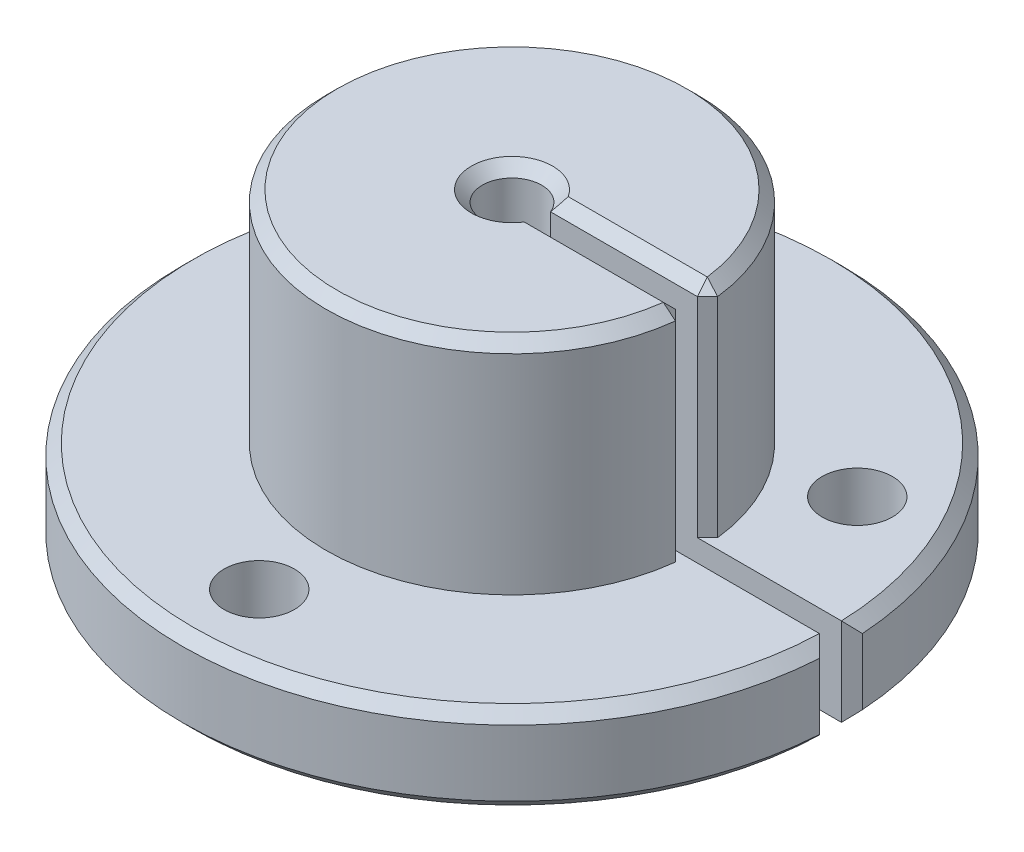
ISO-10303-21;
HEADER;
FILE_DESCRIPTION(('STEP AP214'),'2;1');
FILE_NAME('part.step','',(''),(''),'','','');
FILE_SCHEMA(('AUTOMOTIVE_DESIGN { 1 0 10303 214 1 1 1 1 }'));
ENDSEC;
DATA;
#1=APPLICATION_CONTEXT('core data for automotive mechanical design processes');
#2=APPLICATION_PROTOCOL_DEFINITION('international standard','automotive_design',2000,#1);
#3=PRODUCT_CONTEXT('',#1,'mechanical');
#4=PRODUCT('Part','Part','',(#3));
#5=PRODUCT_RELATED_PRODUCT_CATEGORY('part','',(#4));
#6=PRODUCT_DEFINITION_FORMATION('','',#4);
#7=PRODUCT_DEFINITION_CONTEXT('part definition',#1,'design');
#8=PRODUCT_DEFINITION('design','',#6,#7);
#9=PRODUCT_DEFINITION_SHAPE('','',#8);
#10=(LENGTH_UNIT() NAMED_UNIT(*) SI_UNIT(.MILLI.,.METRE.));
#11=(NAMED_UNIT(*) PLANE_ANGLE_UNIT() SI_UNIT($,.RADIAN.));
#12=(NAMED_UNIT(*) SI_UNIT($,.STERADIAN.) SOLID_ANGLE_UNIT());
#13=UNCERTAINTY_MEASURE_WITH_UNIT(LENGTH_MEASURE(1.E-05),#10,'distance_accuracy_value','');
#14=(GEOMETRIC_REPRESENTATION_CONTEXT(3) GLOBAL_UNCERTAINTY_ASSIGNED_CONTEXT((#13)) GLOBAL_UNIT_ASSIGNED_CONTEXT((#10,
#11,#12)) REPRESENTATION_CONTEXT('',''));
#15=CARTESIAN_POINT('',(0.,0.,0.));
#16=DIRECTION('',(0.,0.,1.));
#17=DIRECTION('',(1.,0.,0.));
#18=AXIS2_PLACEMENT_3D('',#15,#16,#17);
#19=CARTESIAN_POINT('',(0.,10.,0.));
#20=DIRECTION('',(0.,-1.,0.));
#21=DIRECTION('',(0.,0.,-1.));
#22=AXIS2_PLACEMENT_3D('',#19,#20,#21);
#23=CYLINDRICAL_SURFACE('',#22,8.45);
#24=CARTESIAN_POINT('',(0.,9.5,0.));
#25=DIRECTION('',(0.,1.,0.));
#26=DIRECTION('',(0.,0.,1.));
#27=AXIS2_PLACEMENT_3D('',#24,#25,#26);
#28=CIRCLE('',#27,8.45);
#29=CARTESIAN_POINT('',(8.39528047259499,9.5,0.960086343234377));
#30=VERTEX_POINT('',#29);
#31=CARTESIAN_POINT('',(8.39528047259499,9.5,-0.960086343234371));
#32=VERTEX_POINT('',#31);
#33=EDGE_CURVE('E448',#30,#32,#28,.F.);
#34=ORIENTED_EDGE('',*,*,#33,.T.);
#35=DIRECTION('',(0.,-1.,0.));
#36=VECTOR('',#35,1.);
#37=CARTESIAN_POINT('',(8.39528047259499,10.,-0.960086343234371));
#38=LINE('',#37,#36);
#39=CARTESIAN_POINT('',(8.39528047259499,0.,-0.960086343234371));
#40=VERTEX_POINT('',#39);
#41=EDGE_CURVE('E450',#32,#40,#38,.T.);
#42=ORIENTED_EDGE('',*,*,#41,.T.);
#43=CARTESIAN_POINT('',(0.,0.,0.));
#44=DIRECTION('',(0.,-1.,0.));
#45=DIRECTION('',(0.,0.,-1.));
#46=AXIS2_PLACEMENT_3D('',#43,#44,#45);
#47=CIRCLE('',#46,8.45);
#48=CARTESIAN_POINT('',(8.39528047259499,0.,0.960086343234377));
#49=VERTEX_POINT('',#48);
#50=EDGE_CURVE('E351',#49,#40,#47,.T.);
#51=ORIENTED_EDGE('',*,*,#50,.F.);
#52=DIRECTION('',(0.,-1.,0.));
#53=VECTOR('',#52,1.);
#54=CARTESIAN_POINT('',(8.39528047259499,10.,0.960086343234377));
#55=LINE('',#54,#53);
#56=EDGE_CURVE('E446',#49,#30,#55,.F.);
#57=ORIENTED_EDGE('',*,*,#56,.T.);
#58=EDGE_LOOP('',(#34,#42,#51,#57));
#59=FACE_BOUND('',#58,.T.);
#60=ADVANCED_FACE('F35',(#59),#23,.T.);
#61=CARTESIAN_POINT('',(0.,10.,0.));
#62=DIRECTION('',(0.,1.,0.));
#63=DIRECTION('',(0.,0.,1.));
#64=AXIS2_PLACEMENT_3D('',#61,#62,#63);
#65=PLANE('',#64);
#66=CARTESIAN_POINT('',(0.,10.,0.));
#67=DIRECTION('',(0.,1.,0.));
#68=DIRECTION('',(0.,0.,1.));
#69=AXIS2_PLACEMENT_3D('',#66,#67,#68);
#70=CIRCLE('',#69,7.95000000000001);
#71=CARTESIAN_POINT('',(7.88685615438751,10.,-0.999999999999997));
#72=VERTEX_POINT('',#71);
#73=CARTESIAN_POINT('',(7.88685615438751,10.,0.999999999999992));
#74=VERTEX_POINT('',#73);
#75=EDGE_CURVE('E440',#72,#74,#70,.T.);
#76=ORIENTED_EDGE('',*,*,#75,.T.);
#77=DIRECTION('',(-1.,0.,0.));
#78=VECTOR('',#77,1.);
#79=CARTESIAN_POINT('',(1.25399362039845,10.,0.999999999999993));
#80=LINE('',#79,#78);
#81=CARTESIAN_POINT('',(1.55643824162734,10.,0.999999999999993));
#82=VERTEX_POINT('',#81);
#83=EDGE_CURVE('E442',#74,#82,#80,.T.);
#84=ORIENTED_EDGE('',*,*,#83,.T.);
#85=CARTESIAN_POINT('',(0.,10.,0.));
#86=DIRECTION('',(0.,1.,0.));
#87=DIRECTION('',(0.,0.,1.));
#88=AXIS2_PLACEMENT_3D('',#85,#86,#87);
#89=CIRCLE('',#88,1.85);
#90=CARTESIAN_POINT('',(1.55643824162734,10.,-0.999999999999994));
#91=VERTEX_POINT('',#90);
#92=EDGE_CURVE('E433',#82,#91,#89,.F.);
#93=ORIENTED_EDGE('',*,*,#92,.T.);
#94=DIRECTION('',(1.,0.,0.));
#95=VECTOR('',#94,1.);
#96=CARTESIAN_POINT('',(8.43519412936063,10.,-0.999999999999997));
#97=LINE('',#96,#95);
#98=EDGE_CURVE('E439',#91,#72,#97,.T.);
#99=ORIENTED_EDGE('',*,*,#98,.T.);
#100=EDGE_LOOP('',(#76,#84,#93,#99));
#101=FACE_BOUND('',#100,.T.);
#102=ADVANCED_FACE('F295',(#101),#65,.T.);
#103=CARTESIAN_POINT('',(0.,-4.,0.));
#104=DIRECTION('',(0.,1.,0.));
#105=DIRECTION('',(0.,0.,1.));
#106=AXIS2_PLACEMENT_3D('',#103,#104,#105);
#107=CYLINDRICAL_SURFACE('',#106,15.);
#108=CARTESIAN_POINT('',(0.,-3.50000000000001,0.));
#109=DIRECTION('',(0.,-1.,0.));
#110=DIRECTION('',(0.,0.,-1.));
#111=AXIS2_PLACEMENT_3D('',#108,#109,#110);
#112=CIRCLE('',#111,15.);
#113=CARTESIAN_POINT('',(14.9681801465694,-3.50000000000001,-0.976515796004441));
#114=VERTEX_POINT('',#113);
#115=CARTESIAN_POINT('',(14.9681801465694,-3.50000000000001,0.976515796004442));
#116=VERTEX_POINT('',#115);
#117=EDGE_CURVE('E358',#114,#116,#112,.F.);
#118=ORIENTED_EDGE('',*,*,#117,.T.);
#119=DIRECTION('',(0.,1.,0.));
#120=VECTOR('',#119,1.);
#121=CARTESIAN_POINT('',(14.9681801465694,-4.,0.976515796004442));
#122=LINE('',#121,#120);
#123=CARTESIAN_POINT('',(14.9681801465694,-0.499999999999995,0.976515796004442));
#124=VERTEX_POINT('',#123);
#125=EDGE_CURVE('E489',#116,#124,#122,.T.);
#126=ORIENTED_EDGE('',*,*,#125,.T.);
#127=CARTESIAN_POINT('',(0.,-0.499999999999995,0.));
#128=DIRECTION('',(0.,-1.,0.));
#129=DIRECTION('',(0.,0.,-1.));
#130=AXIS2_PLACEMENT_3D('',#127,#128,#129);
#131=CIRCLE('',#130,15.);
#132=CARTESIAN_POINT('',(14.9681801465694,-0.499999999999995,-0.976515796004441));
#133=VERTEX_POINT('',#132);
#134=EDGE_CURVE('E484',#124,#133,#131,.T.);
#135=ORIENTED_EDGE('',*,*,#134,.T.);
#136=DIRECTION('',(0.,1.,0.));
#137=VECTOR('',#136,1.);
#138=CARTESIAN_POINT('',(14.9681801465694,-4.,-0.976515796004441));
#139=LINE('',#138,#137);
#140=EDGE_CURVE('E486',#133,#114,#139,.F.);
#141=ORIENTED_EDGE('',*,*,#140,.T.);
#142=EDGE_LOOP('',(#118,#126,#135,#141));
#143=FACE_BOUND('',#142,.T.);
#144=ADVANCED_FACE('F301',(#143),#107,.T.);
#145=CARTESIAN_POINT('',(0.,-4.,0.));
#146=DIRECTION('',(0.,-1.,0.));
#147=DIRECTION('',(0.,0.,-1.));
#148=AXIS2_PLACEMENT_3D('',#145,#146,#147);
#149=PLANE('',#148);
#150=CARTESIAN_POINT('',(0.,-4.,11.5));
#151=DIRECTION('',(0.,-1.,0.));
#152=DIRECTION('',(0.,0.,-1.));
#153=AXIS2_PLACEMENT_3D('',#150,#151,#152);
#154=CIRCLE('',#153,3.15);
#155=CARTESIAN_POINT('',(-1.07774925952802,-4.,14.4598913043534));
#156=VERTEX_POINT('',#155);
#157=CARTESIAN_POINT('',(1.07774925954286,-4.,14.4598913043479));
#158=VERTEX_POINT('',#157);
#159=EDGE_CURVE('E50',#156,#158,#154,.T.);
#160=ORIENTED_EDGE('',*,*,#159,.F.);
#161=CARTESIAN_POINT('',(0.,-4.,0.));
#162=DIRECTION('',(0.,-1.,0.));
#163=DIRECTION('',(0.,0.,-1.));
#164=AXIS2_PLACEMENT_3D('',#161,#162,#163);
#165=CIRCLE('',#164,14.5);
#166=CARTESIAN_POINT('',(-13.0615078352977,-4.,-6.29658741450128));
#167=VERTEX_POINT('',#166);
#168=EDGE_CURVE('E57',#156,#167,#165,.T.);
#169=ORIENTED_EDGE('',*,*,#168,.T.);
#170=CARTESIAN_POINT('',(-9.95929214352061,-4.,-5.75000000000019));
#171=DIRECTION('',(0.,-1.,0.));
#172=DIRECTION('',(0.,0.,-1.));
#173=AXIS2_PLACEMENT_3D('',#170,#171,#172);
#174=CIRCLE('',#173,3.15);
#175=CARTESIAN_POINT('',(-11.9837585757656,-4.,-8.16330388983946));
#176=VERTEX_POINT('',#175);
#177=EDGE_CURVE('E463',#176,#167,#174,.T.);
#178=ORIENTED_EDGE('',*,*,#177,.F.);
#179=CARTESIAN_POINT('',(11.9837585757553,-4.,-8.1633038898483));
#180=VERTEX_POINT('',#179);
#181=EDGE_CURVE('E172',#176,#180,#165,.T.);
#182=ORIENTED_EDGE('',*,*,#181,.T.);
#183=CARTESIAN_POINT('',(9.95929214352151,-4.,-5.74999999999978));
#184=DIRECTION('',(0.,-1.,0.));
#185=DIRECTION('',(0.,0.,-1.));
#186=AXIS2_PLACEMENT_3D('',#183,#184,#185);
#187=CIRCLE('',#186,3.15);
#188=CARTESIAN_POINT('',(13.0615078352958,-4.,-6.2965874145179));
#189=VERTEX_POINT('',#188);
#190=EDGE_CURVE('E345',#189,#180,#187,.T.);
#191=ORIENTED_EDGE('',*,*,#190,.F.);
#192=CARTESIAN_POINT('',(14.4913767461894,-4.,-0.500000000000007));
#193=VERTEX_POINT('',#192);
#194=EDGE_CURVE('E175',#189,#193,#165,.T.);
#195=ORIENTED_EDGE('',*,*,#194,.T.);
#196=DIRECTION('',(-1.,0.,0.));
#197=VECTOR('',#196,1.);
#198=CARTESIAN_POINT('',(30.0000000000001,-4.,-0.500000000000015));
#199=LINE('',#198,#197);
#200=CARTESIAN_POINT('',(1.78115131305568,-4.,-0.500000000000001));
#201=VERTEX_POINT('',#200);
#202=EDGE_CURVE('E343',#193,#201,#199,.T.);
#203=ORIENTED_EDGE('',*,*,#202,.T.);
#204=CARTESIAN_POINT('',(0.,-4.,0.));
#205=DIRECTION('',(0.,-1.,0.));
#206=DIRECTION('',(0.,0.,-1.));
#207=AXIS2_PLACEMENT_3D('',#204,#205,#206);
#208=CIRCLE('',#207,1.85);
#209=CARTESIAN_POINT('',(1.78115131305569,-4.,0.5));
#210=VERTEX_POINT('',#209);
#211=EDGE_CURVE('E178',#201,#210,#208,.F.);
#212=ORIENTED_EDGE('',*,*,#211,.T.);
#213=DIRECTION('',(1.,0.,0.));
#214=VECTOR('',#213,1.);
#215=CARTESIAN_POINT('',(30.0000000000001,-4.,0.499999999999997));
#216=LINE('',#215,#214);
#217=CARTESIAN_POINT('',(14.4913767461894,-4.,0.499999999999998));
#218=VERTEX_POINT('',#217);
#219=EDGE_CURVE('E352',#210,#218,#216,.T.);
#220=ORIENTED_EDGE('',*,*,#219,.T.);
#221=EDGE_CURVE('E166',#218,#158,#165,.T.);
#222=ORIENTED_EDGE('',*,*,#221,.T.);
#223=EDGE_LOOP('',(#160,#169,#178,#182,#191,#195,#203,#212,#220,#222));
#224=FACE_BOUND('',#223,.T.);
#225=ADVANCED_FACE('F164',(#224),#149,.T.);
#226=CARTESIAN_POINT('',(0.,0.,0.));
#227=DIRECTION('',(0.,-1.,0.));
#228=DIRECTION('',(0.,0.,-1.));
#229=AXIS2_PLACEMENT_3D('',#226,#227,#228);
#230=PLANE('',#229);
#231=CARTESIAN_POINT('',(0.,0.,11.5));
#232=DIRECTION('',(0.,-1.,0.));
#233=DIRECTION('',(0.,0.,-1.));
#234=AXIS2_PLACEMENT_3D('',#231,#232,#233);
#235=CIRCLE('',#234,1.59999999999999);
#236=CARTESIAN_POINT('',(0.,0.,9.90000000000001));
#237=VERTEX_POINT('',#236);
#238=EDGE_CURVE('E40',#237,#237,#235,.T.);
#239=ORIENTED_EDGE('',*,*,#238,.T.);
#240=EDGE_LOOP('',(#239));
#241=FACE_BOUND('',#240,.T.);
#242=CARTESIAN_POINT('',(-9.95929214352061,0.,-5.75000000000019));
#243=DIRECTION('',(0.,-1.,0.));
#244=DIRECTION('',(0.,0.,-1.));
#245=AXIS2_PLACEMENT_3D('',#242,#243,#244);
#246=CIRCLE('',#245,1.59999999999999);
#247=CARTESIAN_POINT('',(-9.95929214352061,0.,-7.35000000000019));
#248=VERTEX_POINT('',#247);
#249=EDGE_CURVE('E268',#248,#248,#246,.T.);
#250=ORIENTED_EDGE('',*,*,#249,.T.);
#251=EDGE_LOOP('',(#250));
#252=FACE_BOUND('',#251,.T.);
#253=CARTESIAN_POINT('',(9.95929214352151,0.,-5.74999999999978));
#254=DIRECTION('',(0.,-1.,0.));
#255=DIRECTION('',(0.,0.,-1.));
#256=AXIS2_PLACEMENT_3D('',#253,#254,#255);
#257=CIRCLE('',#256,1.59999999999999);
#258=CARTESIAN_POINT('',(9.95929214352151,0.,-7.34999999999977));
#259=VERTEX_POINT('',#258);
#260=EDGE_CURVE('E267',#259,#259,#257,.T.);
#261=ORIENTED_EDGE('',*,*,#260,.T.);
#262=EDGE_LOOP('',(#261));
#263=FACE_BOUND('',#262,.T.);
#264=DIRECTION('',(1.,0.,0.));
#265=VECTOR('',#264,1.);
#266=CARTESIAN_POINT('',(0.,0.,-0.5));
#267=LINE('',#266,#265);
#268=CARTESIAN_POINT('',(7.93519412936062,0.,-0.500000000000004));
#269=VERTEX_POINT('',#268);
#270=CARTESIAN_POINT('',(14.4913767461894,0.,-0.500000000000007));
#271=VERTEX_POINT('',#270);
#272=EDGE_CURVE('E478',#269,#271,#267,.T.);
#273=ORIENTED_EDGE('',*,*,#272,.T.);
#274=CARTESIAN_POINT('',(0.,0.,0.));
#275=DIRECTION('',(0.,-1.,0.));
#276=DIRECTION('',(0.,0.,-1.));
#277=AXIS2_PLACEMENT_3D('',#274,#275,#276);
#278=CIRCLE('',#277,14.5);
#279=CARTESIAN_POINT('',(14.4913767461894,0.,0.499999999999998));
#280=VERTEX_POINT('',#279);
#281=EDGE_CURVE('E216',#271,#280,#278,.F.);
#282=ORIENTED_EDGE('',*,*,#281,.T.);
#283=DIRECTION('',(-1.,0.,0.));
#284=VECTOR('',#283,1.);
#285=CARTESIAN_POINT('',(0.,0.,0.5));
#286=LINE('',#285,#284);
#287=CARTESIAN_POINT('',(7.93519412936062,0.,0.499999999999999));
#288=VERTEX_POINT('',#287);
#289=EDGE_CURVE('E476',#280,#288,#286,.T.);
#290=ORIENTED_EDGE('',*,*,#289,.T.);
#291=DIRECTION('',(0.707106781186547,0.,0.707106781186548));
#292=VECTOR('',#291,1.);
#293=CARTESIAN_POINT('',(3.71759706468032,0.,-3.71759706468031));
#294=LINE('',#293,#292);
#295=EDGE_CURVE('E457',#288,#49,#294,.T.);
#296=ORIENTED_EDGE('',*,*,#295,.T.);
#297=ORIENTED_EDGE('',*,*,#50,.T.);
#298=DIRECTION('',(0.707106781186552,0.,-0.707106781186543));
#299=VECTOR('',#298,1.);
#300=CARTESIAN_POINT('',(3.71759706468026,0.,3.71759706468031));
#301=LINE('',#300,#299);
#302=EDGE_CURVE('E455',#40,#269,#301,.F.);
#303=ORIENTED_EDGE('',*,*,#302,.T.);
#304=EDGE_LOOP('',(#273,#282,#290,#296,#297,#303));
#305=FACE_BOUND('',#304,.T.);
#306=ADVANCED_FACE('F201',(#241,#252,#263,#305),#230,.F.);
#307=CARTESIAN_POINT('',(30.0000000000001,-4.,-0.500000000000015));
#308=DIRECTION('',(0.,0.,-1.));
#309=DIRECTION('',(-1.,0.,0.));
#310=AXIS2_PLACEMENT_3D('',#307,#308,#309);
#311=PLANE('',#310);
#312=ORIENTED_EDGE('',*,*,#202,.F.);
#313=CARTESIAN_POINT('',(14.4913767461894,-4.,-0.500000000000007));
#314=CARTESIAN_POINT('',(14.491424680252,-3.99995209444358,-0.500000000000007));
#315=CARTESIAN_POINT('',(14.4914726143146,-3.99990418888716,-0.500000000000007));
#316=CARTESIAN_POINT('',(14.4915684824398,-3.99980837777433,-0.500000000000007));
#317=CARTESIAN_POINT('',(14.4916164165024,-3.99976047221791,-0.500000000000007));
#318=CARTESIAN_POINT('',(14.491664350565,-3.99971256666149,-0.500000000000007));
#319=B_SPLINE_CURVE_WITH_KNOTS('',3,(#313,#314,#315,#316,#317,#318),.UNSPECIFIED.,.F.,.F.,(4,2,
4),(0.,0.000203306542502139,0.000406613085003665),.UNSPECIFIED.);
#320=CARTESIAN_POINT('',(14.491664350565,-3.99971256666149,-0.500000000000007));
#321=VERTEX_POINT('',#320);
#322=EDGE_CURVE('E210',#193,#321,#319,.T.);
#323=ORIENTED_EDGE('',*,*,#322,.T.);
#324=DIRECTION('',(0.,1.,0.));
#325=VECTOR('',#324,1.);
#326=CARTESIAN_POINT('',(14.491664350565,-4.,-0.500000000000007));
#327=LINE('',#326,#325);
#328=CARTESIAN_POINT('',(14.491664350565,-0.000287433338519438,-0.500000000000007));
#329=VERTEX_POINT('',#328);
#330=EDGE_CURVE('E217',#321,#329,#327,.T.);
#331=ORIENTED_EDGE('',*,*,#330,.T.);
#332=CARTESIAN_POINT('',(14.491664350565,-0.000287433338519438,-0.500000000000007));
#333=CARTESIAN_POINT('',(14.4916164165024,-0.000239527782099452,-0.500000000000007));
#334=CARTESIAN_POINT('',(14.4915684824398,-0.000191622225679611,-0.500000000000007));
#335=CARTESIAN_POINT('',(14.4914726143146,-9.58111128399288E-05,-0.500000000000007));
#336=CARTESIAN_POINT('',(14.491424680252,-4.79055564200875E-05,-0.500000000000007));
#337=CARTESIAN_POINT('',(14.4913767461894,0.,-0.500000000000007));
#338=B_SPLINE_CURVE_WITH_KNOTS('',3,(#332,#333,#334,#335,#336,#337),.UNSPECIFIED.,.F.,.F.,(4,2,
4),(0.,0.000203306542505681,0.000406613085012588),.UNSPECIFIED.);
#339=EDGE_CURVE('E189',#329,#271,#338,.T.);
#340=ORIENTED_EDGE('',*,*,#339,.T.);
#341=ORIENTED_EDGE('',*,*,#272,.F.);
#342=DIRECTION('',(0.,1.,0.));
#343=VECTOR('',#342,1.);
#344=CARTESIAN_POINT('',(7.93519412936062,-4.,-0.500000000000004));
#345=LINE('',#344,#343);
#346=CARTESIAN_POINT('',(7.93519412936062,9.5,-0.500000000000004));
#347=VERTEX_POINT('',#346);
#348=EDGE_CURVE('E174',#269,#347,#345,.T.);
#349=ORIENTED_EDGE('',*,*,#348,.T.);
#350=DIRECTION('',(-1.,0.,0.));
#351=VECTOR('',#350,1.);
#352=CARTESIAN_POINT('',(1.25399362039845,9.5,-0.500000000000001));
#353=LINE('',#352,#351);
#354=CARTESIAN_POINT('',(1.25399362039845,9.5,-0.500000000000001));
#355=VERTEX_POINT('',#354);
#356=EDGE_CURVE('E181',#347,#355,#353,.T.);
#357=ORIENTED_EDGE('',*,*,#356,.T.);
#358=DIRECTION('',(0.,1.,0.));
#359=VECTOR('',#358,1.);
#360=CARTESIAN_POINT('',(1.25399362039845,-4.,-0.500000000000001));
#361=LINE('',#360,#359);
#362=CARTESIAN_POINT('',(1.25399362039845,-3.5,-0.500000000000001));
#363=VERTEX_POINT('',#362);
#364=EDGE_CURVE('E361',#355,#363,#361,.F.);
#365=ORIENTED_EDGE('',*,*,#364,.T.);
#366=CARTESIAN_POINT('',(1.25399362039845,-3.5,-0.500000000000001));
#367=CARTESIAN_POINT('',(1.29835268877856,-3.54121220690126,-0.500000000000001));
#368=CARTESIAN_POINT('',(1.34256979968262,-3.58257645244402,-0.500000000000001));
#369=CARTESIAN_POINT('',(1.43077410717665,-3.66554776873232,-0.500000000000001));
#370=CARTESIAN_POINT('',(1.47476130817168,-3.70715483479288,-0.500000000000001));
#371=CARTESIAN_POINT('',(1.56256113615837,-3.79055178571028,-0.500000000000001));
#372=CARTESIAN_POINT('',(1.60637376458746,-3.83234166905586,-0.500000000000001));
#373=CARTESIAN_POINT('',(1.69385921436994,-3.91606922789082,-0.500000000000001));
#374=CARTESIAN_POINT('',(1.73753203304079,-3.95800690618389,-0.500000000000001));
#375=CARTESIAN_POINT('',(1.78115131305569,-4.,-0.500000000000001));
#376=B_SPLINE_CURVE_WITH_KNOTS('',3,(#366,#367,#368,#369,#370,#371,#372,#373,#374,#375),
.UNSPECIFIED.,.F.,.F.,(4,2,2,2,4),(0.,0.181645695916576,0.36328789865824,0.544928602666847,
0.72657277117135),.UNSPECIFIED.);
#377=EDGE_CURVE('E183',#363,#201,#376,.T.);
#378=ORIENTED_EDGE('',*,*,#377,.T.);
#379=EDGE_LOOP('',(#312,#323,#331,#340,#341,#349,#357,#365,#378));
#380=FACE_BOUND('',#379,.T.);
#381=ADVANCED_FACE('F195',(#380),#311,.F.);
#382=CARTESIAN_POINT('',(30.0000000000001,-4.,0.499999999999997));
#383=DIRECTION('',(0.,0.,1.));
#384=DIRECTION('',(1.,0.,0.));
#385=AXIS2_PLACEMENT_3D('',#382,#383,#384);
#386=PLANE('',#385);
#387=DIRECTION('',(0.,-1.,0.));
#388=VECTOR('',#387,1.);
#389=CARTESIAN_POINT('',(14.4916643505649,-4.,0.499999999999998));
#390=LINE('',#389,#388);
#391=CARTESIAN_POINT('',(14.4916643505649,-0.000287433338505561,0.499999999999998));
#392=VERTEX_POINT('',#391);
#393=CARTESIAN_POINT('',(14.4916643505649,-3.9997125666615,0.499999999999998));
#394=VERTEX_POINT('',#393);
#395=EDGE_CURVE('E326',#392,#394,#390,.T.);
#396=ORIENTED_EDGE('',*,*,#395,.T.);
#397=CARTESIAN_POINT('',(14.4916643505649,-3.9997125666615,0.499999999999998));
#398=CARTESIAN_POINT('',(14.4916164165024,-3.99976047221792,0.499999999999998));
#399=CARTESIAN_POINT('',(14.4915684824398,-3.99980837777433,0.499999999999998));
#400=CARTESIAN_POINT('',(14.4914726143146,-3.99990418888717,0.499999999999998));
#401=CARTESIAN_POINT('',(14.491424680252,-3.99995209444358,0.499999999999998));
#402=CARTESIAN_POINT('',(14.4913767461895,-4.,0.499999999999998));
#403=B_SPLINE_CURVE_WITH_KNOTS('',3,(#397,#398,#399,#400,#401,#402),.UNSPECIFIED.,.F.,.F.,(4,2,
4),(0.,0.000203306542491099,0.000406613084983425),.UNSPECIFIED.);
#404=EDGE_CURVE('E247',#394,#218,#403,.T.);
#405=ORIENTED_EDGE('',*,*,#404,.T.);
#406=ORIENTED_EDGE('',*,*,#219,.F.);
#407=CARTESIAN_POINT('',(1.78115131305569,-4.,0.5));
#408=CARTESIAN_POINT('',(1.73753203304079,-3.95800690618389,0.5));
#409=CARTESIAN_POINT('',(1.69385921436994,-3.91606922789082,0.5));
#410=CARTESIAN_POINT('',(1.60637376458746,-3.83234166905586,0.5));
#411=CARTESIAN_POINT('',(1.56256113615837,-3.79055178571028,0.5));
#412=CARTESIAN_POINT('',(1.47476130817168,-3.70715483479288,0.5));
#413=CARTESIAN_POINT('',(1.43077410717665,-3.66554776873232,0.5));
#414=CARTESIAN_POINT('',(1.34256979968262,-3.58257645244402,0.5));
#415=CARTESIAN_POINT('',(1.29835268877856,-3.54121220690126,0.5));
#416=CARTESIAN_POINT('',(1.25399362039845,-3.5,0.5));
#417=B_SPLINE_CURVE_WITH_KNOTS('',3,(#407,#408,#409,#410,#411,#412,#413,#414,#415,#416),
.UNSPECIFIED.,.F.,.F.,(4,2,2,2,4),(0.,0.181644168504503,0.363284872513111,0.544927075254774,
0.726572771171351),.UNSPECIFIED.);
#418=CARTESIAN_POINT('',(1.25399362039845,-3.5,0.5));
#419=VERTEX_POINT('',#418);
#420=EDGE_CURVE('E327',#210,#419,#417,.T.);
#421=ORIENTED_EDGE('',*,*,#420,.T.);
#422=DIRECTION('',(0.,1.,0.));
#423=VECTOR('',#422,1.);
#424=CARTESIAN_POINT('',(1.25399362039845,-4.,0.5));
#425=LINE('',#424,#423);
#426=CARTESIAN_POINT('',(1.25399362039845,9.5,0.5));
#427=VERTEX_POINT('',#426);
#428=EDGE_CURVE('E481',#419,#427,#425,.T.);
#429=ORIENTED_EDGE('',*,*,#428,.T.);
#430=DIRECTION('',(1.,0.,0.));
#431=VECTOR('',#430,1.);
#432=CARTESIAN_POINT('',(8.43519412936063,9.5,0.499999999999999));
#433=LINE('',#432,#431);
#434=CARTESIAN_POINT('',(7.93519412936062,9.5,0.499999999999999));
#435=VERTEX_POINT('',#434);
#436=EDGE_CURVE('E494',#427,#435,#433,.T.);
#437=ORIENTED_EDGE('',*,*,#436,.T.);
#438=DIRECTION('',(0.,-1.,0.));
#439=VECTOR('',#438,1.);
#440=CARTESIAN_POINT('',(7.93519412936062,-4.,0.499999999999999));
#441=LINE('',#440,#439);
#442=EDGE_CURVE('E492',#435,#288,#441,.T.);
#443=ORIENTED_EDGE('',*,*,#442,.T.);
#444=ORIENTED_EDGE('',*,*,#289,.F.);
#445=CARTESIAN_POINT('',(14.4913767461894,0.,0.499999999999998));
#446=CARTESIAN_POINT('',(14.491424680252,-4.79055564174774E-05,0.499999999999998));
#447=CARTESIAN_POINT('',(14.4914726143146,-9.58111128349549E-05,0.499999999999998));
#448=CARTESIAN_POINT('',(14.4915684824398,-0.00019162222566991,0.499999999999998));
#449=CARTESIAN_POINT('',(14.4916164165024,-0.000239527782087387,0.499999999999998));
#450=CARTESIAN_POINT('',(14.4916643505649,-0.000287433338504865,0.499999999999998));
#451=B_SPLINE_CURVE_WITH_KNOTS('',3,(#445,#446,#447,#448,#449,#450),.UNSPECIFIED.,.F.,.F.,(4,2,
4),(0.,0.000203306542496987,0.000406613084993973),.UNSPECIFIED.);
#452=EDGE_CURVE('E321',#280,#392,#451,.T.);
#453=ORIENTED_EDGE('',*,*,#452,.T.);
#454=EDGE_LOOP('',(#396,#405,#406,#421,#429,#437,#443,#444,#453));
#455=FACE_BOUND('',#454,.T.);
#456=ADVANCED_FACE('F200',(#455),#386,.F.);
#457=CARTESIAN_POINT('',(0.,-4.,0.));
#458=DIRECTION('',(0.,1.,0.));
#459=DIRECTION('',(0.,0.,1.));
#460=AXIS2_PLACEMENT_3D('',#457,#458,#459);
#461=CYLINDRICAL_SURFACE('',#460,1.35);
#462=ORIENTED_EDGE('',*,*,#364,.F.);
#463=CARTESIAN_POINT('',(0.,9.5,0.));
#464=DIRECTION('',(0.,1.,0.));
#465=DIRECTION('',(0.,0.,1.));
#466=AXIS2_PLACEMENT_3D('',#463,#464,#465);
#467=CIRCLE('',#466,1.35);
#468=EDGE_CURVE('E435',#355,#427,#467,.T.);
#469=ORIENTED_EDGE('',*,*,#468,.T.);
#470=ORIENTED_EDGE('',*,*,#428,.F.);
#471=CARTESIAN_POINT('',(0.,-3.5,0.));
#472=DIRECTION('',(0.,-1.,0.));
#473=DIRECTION('',(0.,0.,-1.));
#474=AXIS2_PLACEMENT_3D('',#471,#472,#473);
#475=CIRCLE('',#474,1.35);
#476=EDGE_CURVE('E452',#419,#363,#475,.T.);
#477=ORIENTED_EDGE('',*,*,#476,.T.);
#478=EDGE_LOOP('',(#462,#469,#470,#477));
#479=FACE_BOUND('',#478,.T.);
#480=ADVANCED_FACE('F203',(#479),#461,.F.);
#481=CARTESIAN_POINT('',(14.9681801465694,-4.,-0.976515796004442));
#482=DIRECTION('',(0.70710678118655,0.,0.707106781186545));
#483=DIRECTION('',(0.,1.,0.));
#484=AXIS2_PLACEMENT_3D('',#481,#482,#483);
#485=PLANE('',#484);
#486=CARTESIAN_POINT('',(14.491664350565,-0.000287433338519454,-0.500000000000007));
#487=CARTESIAN_POINT('',(14.5714743922749,-0.0828276968292512,-0.579810041709943));
#488=CARTESIAN_POINT('',(14.6510890701636,-0.165740550296099,-0.659424719598701));
#489=CARTESIAN_POINT('',(14.8099276686861,-0.332311406127776,-0.818263318121157));
#490=CARTESIAN_POINT('',(14.8891515894655,-0.415969408214754,-0.897487238900544));
#491=CARTESIAN_POINT('',(14.9681801465694,-0.499999999999996,-0.976515796004442));
#492=B_SPLINE_CURVE_WITH_KNOTS('',3,(#486,#487,#488,#489,#490,#491),.UNSPECIFIED.,.F.,.F.,(4,2,
4),(0.,0.419480412255551,0.83896066810142),.UNSPECIFIED.);
#493=EDGE_CURVE('E316',#329,#133,#492,.T.);
#494=ORIENTED_EDGE('',*,*,#493,.F.);
#495=ORIENTED_EDGE('',*,*,#330,.F.);
#496=CARTESIAN_POINT('',(14.491664350565,-3.99971256666149,-0.500000000000007));
#497=CARTESIAN_POINT('',(14.5714743922749,-3.91717230317076,-0.579810041709943));
#498=CARTESIAN_POINT('',(14.6510890701636,-3.83425944970391,-0.659424719598701));
#499=CARTESIAN_POINT('',(14.8099276686861,-3.66768859387223,-0.818263318121157));
#500=CARTESIAN_POINT('',(14.8891515894655,-3.58403059178525,-0.897487238900544));
#501=CARTESIAN_POINT('',(14.9681801465694,-3.50000000000001,-0.976515796004442));
#502=B_SPLINE_CURVE_WITH_KNOTS('',3,(#496,#497,#498,#499,#500,#501),.UNSPECIFIED.,.F.,.F.,(4,2,
4),(0.,0.419480412255551,0.838960668101421),.UNSPECIFIED.);
#503=EDGE_CURVE('E241',#114,#321,#502,.F.);
#504=ORIENTED_EDGE('',*,*,#503,.F.);
#505=ORIENTED_EDGE('',*,*,#140,.F.);
#506=EDGE_LOOP('',(#494,#495,#504,#505));
#507=FACE_BOUND('',#506,.T.);
#508=ADVANCED_FACE('F224',(#507),#485,.T.);
#509=CARTESIAN_POINT('',(0.,-4.,0.));
#510=DIRECTION('',(0.,1.,0.));
#511=DIRECTION('',(0.,0.,1.));
#512=AXIS2_PLACEMENT_3D('',#509,#510,#511);
#513=CONICAL_SURFACE('',#512,14.5,0.785398163397447);
#514=CARTESIAN_POINT('',(1.07917585596787,-4.00020000000008,14.459584347826));
#515=CARTESIAN_POINT('',(0.959473468407769,-3.9833866195448,14.4853892317136));
#516=CARTESIAN_POINT('',(0.838464398235166,-3.96929888415517,14.5070108430274));
#517=CARTESIAN_POINT('',(0.594640347951598,-3.94676426595695,14.5415965832202));
#518=CARTESIAN_POINT('',(0.471824538364839,-3.93832006229207,14.5545566001961));
#519=CARTESIAN_POINT('',(0.227909097102541,-3.92739482429486,14.571324465433));
#520=CARTESIAN_POINT('',(0.106827895986706,-3.9247917862586,14.5753195628597));
#521=CARTESIAN_POINT('',(-0.135236915548752,-3.925234099693,14.5746407078321));
#522=CARTESIAN_POINT('',(-0.256220543731465,-3.92827646780812,14.5699713341799));
#523=CARTESIAN_POINT('',(-0.494590344979652,-3.93981821817376,14.5522572564651));
#524=CARTESIAN_POINT('',(-0.611996689533782,-3.94819474641624,14.5394011065977));
#525=CARTESIAN_POINT('',(-0.846410973379212,-3.97022876577369,14.5055836768836));
#526=CARTESIAN_POINT('',(-0.963401705124942,-3.98394092634777,14.4845384913018));
#527=CARTESIAN_POINT('',(-1.07917585596734,-4.0002,14.4595843478261));
#528=B_SPLINE_CURVE_WITH_KNOTS('',3,(#514,#515,#516,#517,#518,#519,#520,#521,#522,#523,#524,
#525,#526,#527),.UNSPECIFIED.,.F.,.F.,(4,2,2,2,2,2,4),(0.,0.370730144905745,0.741636161091865,
1.1047200112425,1.46761204175948,1.82243431359096,2.18099214917027),.UNSPECIFIED.);
#529=EDGE_CURVE('E11',#158,#156,#528,.T.);
#530=ORIENTED_EDGE('',*,*,#529,.F.);
#531=ORIENTED_EDGE('',*,*,#221,.F.);
#532=ORIENTED_EDGE('',*,*,#404,.F.);
#533=CARTESIAN_POINT('',(14.4916643505649,-3.9997125666615,0.499999999999998));
#534=CARTESIAN_POINT('',(14.5714743922749,-3.91717230317077,0.579810041709936));
#535=CARTESIAN_POINT('',(14.6510890701636,-3.83425944970392,0.659424719598695));
#536=CARTESIAN_POINT('',(14.8099276686861,-3.66768859387224,0.818263318121155));
#537=CARTESIAN_POINT('',(14.8891515894655,-3.58403059178526,0.897487238900543));
#538=CARTESIAN_POINT('',(14.9681801465694,-3.50000000000001,0.976515796004442));
#539=B_SPLINE_CURVE_WITH_KNOTS('',3,(#533,#534,#535,#536,#537,#538),.UNSPECIFIED.,.F.,.F.,(4,2,
4),(0.,0.419480412255562,0.83896066810144),.UNSPECIFIED.);
#540=EDGE_CURVE('E232',#116,#394,#539,.F.);
#541=ORIENTED_EDGE('',*,*,#540,.F.);
#542=ORIENTED_EDGE('',*,*,#117,.F.);
#543=ORIENTED_EDGE('',*,*,#503,.T.);
#544=ORIENTED_EDGE('',*,*,#322,.F.);
#545=ORIENTED_EDGE('',*,*,#194,.F.);
#546=CARTESIAN_POINT('',(11.9827794453973,-4.0002,-8.16438588033194));
#547=CARTESIAN_POINT('',(12.0649783241658,-3.98338661954471,-8.07362301375508));
#548=CARTESIAN_POINT('',(12.1442077239206,-3.96929888415507,-7.97963689055416));
#549=CARTESIAN_POINT('',(12.296071878678,-3.94676426595685,-7.7857719390514));
#550=CARTESIAN_POINT('',(12.368703487406,-3.93832006229196,-7.68589033645087));
#551=CARTESIAN_POINT('',(12.5051826052996,-3.92739482429473,-7.48303730056087));
#552=CARTESIAN_POINT('',(12.5691830617196,-3.92479178625846,-7.38017545318716));
#553=CARTESIAN_POINT('',(12.6896275617879,-3.92523409969285,-7.17020174952138));
#554=CARTESIAN_POINT('',(12.7460755796768,-3.92827646780796,-7.06309216724708));
#555=CARTESIAN_POINT('',(12.8499196389953,-3.9398182181736,-6.84780082501345));
#556=CARTESIAN_POINT('',(12.8974890588924,-3.9481947464161,-6.73969587313019));
#557=CARTESIAN_POINT('',(12.9854094475923,-3.9702287657736,-6.51977843345262));
#558=CARTESIAN_POINT('',(13.025679148124,-3.98394092634771,-6.40793889496235));
#559=CARTESIAN_POINT('',(13.0619553013656,-4.0002,-6.29519846749316));
#560=B_SPLINE_CURVE_WITH_KNOTS('',3,(#546,#547,#548,#549,#550,#551,#552,#553,#554,#555,#556,
#557,#558,#559),.UNSPECIFIED.,.F.,.F.,(4,2,2,2,2,2,4),(0.,0.370730144905743,0.74163616109186,
1.10472001124249,1.46761204175946,1.82243431359166,2.18099214917172),.UNSPECIFIED.);
#561=EDGE_CURVE('E254',#180,#189,#560,.T.);
#562=ORIENTED_EDGE('',*,*,#561,.F.);
#563=ORIENTED_EDGE('',*,*,#181,.F.);
#564=CARTESIAN_POINT('',(-13.0619553013645,-4.00020000000008,-6.29519846749529));
#565=CARTESIAN_POINT('',(-13.0244517925728,-3.98338661954482,-6.41176621795981));
#566=CARTESIAN_POINT('',(-12.9826721221549,-3.9692988841552,-6.52737395247449));
#567=CARTESIAN_POINT('',(-12.8907122266288,-3.94676426595702,-6.75582464417006));
#568=CARTESIAN_POINT('',(-12.84052802577,-3.93832006229216,-6.86866626374648));
#569=CARTESIAN_POINT('',(-12.7330917024011,-3.92739482429497,-7.08828716487333));
#570=CARTESIAN_POINT('',(-12.6760109577053,-3.92479178625873,-7.1951441096737));
#571=CARTESIAN_POINT('',(-12.5543906462381,-3.92523409969316,-7.40443895831187));
#572=CARTESIAN_POINT('',(-12.4898550359442,-3.9282764678083,-7.50687916693403));
#573=CARTESIAN_POINT('',(-12.3553292940146,-3.93981821817394,-7.70445643145228));
#574=CARTESIAN_POINT('',(-12.2854923693577,-3.94819474641642,-7.79970523346766));
#575=CARTESIAN_POINT('',(-12.1389984742123,-3.9702287657738,-7.9858052434302));
#576=CARTESIAN_POINT('',(-12.0622774429985,-3.98394092634783,-8.07659959633819));
#577=CARTESIAN_POINT('',(-11.9827794453978,-4.00020000000001,-8.16438588033119));
#578=B_SPLINE_CURVE_WITH_KNOTS('',3,(#564,#565,#566,#567,#568,#569,#570,#571,#572,#573,#574,
#575,#576,#577),.UNSPECIFIED.,.F.,.F.,(4,2,2,2,2,2,4),(0.,0.370730144905736,0.741636161091846,
1.10472001124248,1.46761204175946,1.82243431358997,2.1809921491683),.UNSPECIFIED.);
#579=EDGE_CURVE('E45',#167,#176,#578,.T.);
#580=ORIENTED_EDGE('',*,*,#579,.F.);
#581=ORIENTED_EDGE('',*,*,#168,.F.);
#582=EDGE_LOOP('',(#530,#531,#532,#541,#542,#543,#544,#545,#562,#563,#580,#581));
#583=FACE_BOUND('',#582,.T.);
#584=ADVANCED_FACE('F170',(#583),#513,.T.);
#585=CARTESIAN_POINT('',(0.,-0.499999999999995,0.));
#586=DIRECTION('',(0.,-1.,0.));
#587=DIRECTION('',(0.,0.,-1.));
#588=AXIS2_PLACEMENT_3D('',#585,#586,#587);
#589=CONICAL_SURFACE('',#588,15.,0.785398163397448);
#590=ORIENTED_EDGE('',*,*,#493,.T.);
#591=ORIENTED_EDGE('',*,*,#134,.F.);
#592=CARTESIAN_POINT('',(14.9681801465694,-0.499999999999995,0.976515796004442));
#593=CARTESIAN_POINT('',(14.8891515894655,-0.415969408214751,0.897487238900543));
#594=CARTESIAN_POINT('',(14.8099276686861,-0.332311406127771,0.818263318121155));
#595=CARTESIAN_POINT('',(14.6510890701636,-0.165740550296089,0.659424719598696));
#596=CARTESIAN_POINT('',(14.5714743922749,-0.0828276968292393,0.579810041709936));
#597=CARTESIAN_POINT('',(14.4916643505649,-0.000287433338505394,0.499999999999999));
#598=B_SPLINE_CURVE_WITH_KNOTS('',3,(#592,#593,#594,#595,#596,#597),.UNSPECIFIED.,.F.,.F.,(4,2,
4),(0.,0.419480255845878,0.83896066810144),.UNSPECIFIED.);
#599=EDGE_CURVE('E310',#392,#124,#598,.F.);
#600=ORIENTED_EDGE('',*,*,#599,.F.);
#601=ORIENTED_EDGE('',*,*,#452,.F.);
#602=ORIENTED_EDGE('',*,*,#281,.F.);
#603=ORIENTED_EDGE('',*,*,#339,.F.);
#604=EDGE_LOOP('',(#590,#591,#600,#601,#602,#603));
#605=FACE_BOUND('',#604,.T.);
#606=ADVANCED_FACE('F223',(#605),#589,.T.);
#607=CARTESIAN_POINT('',(14.9681801465694,-4.,0.976515796004442));
#608=DIRECTION('',(-0.707106781186547,0.,0.707106781186547));
#609=DIRECTION('',(0.,1.,0.));
#610=AXIS2_PLACEMENT_3D('',#607,#608,#609);
#611=PLANE('',#610);
#612=ORIENTED_EDGE('',*,*,#540,.T.);
#613=ORIENTED_EDGE('',*,*,#395,.F.);
#614=ORIENTED_EDGE('',*,*,#599,.T.);
#615=ORIENTED_EDGE('',*,*,#125,.F.);
#616=EDGE_LOOP('',(#612,#613,#614,#615));
#617=FACE_BOUND('',#616,.T.);
#618=ADVANCED_FACE('F225',(#617),#611,.F.);
#619=CARTESIAN_POINT('',(8.395280472595,10.,-0.960086343234373));
#620=DIRECTION('',(-0.707106781186543,0.,-0.707106781186552));
#621=DIRECTION('',(0.,-1.,0.));
#622=AXIS2_PLACEMENT_3D('',#619,#620,#621);
#623=PLANE('',#622);
#624=DIRECTION('',(-0.707106781186552,0.,0.707106781186543));
#625=VECTOR('',#624,1.);
#626=CARTESIAN_POINT('',(8.39528047259499,9.5,-0.960086343234371));
#627=LINE('',#626,#625);
#628=EDGE_CURVE('E369',#347,#32,#627,.F.);
#629=ORIENTED_EDGE('',*,*,#628,.F.);
#630=ORIENTED_EDGE('',*,*,#348,.F.);
#631=ORIENTED_EDGE('',*,*,#302,.F.);
#632=ORIENTED_EDGE('',*,*,#41,.F.);
#633=EDGE_LOOP('',(#629,#630,#631,#632));
#634=FACE_BOUND('',#633,.T.);
#635=ADVANCED_FACE('F505',(#634),#623,.F.);
#636=CARTESIAN_POINT('',(8.39528047259499,9.5,-0.960086343234371));
#637=DIRECTION('',(0.558781470544711,0.612802200021974,0.558781470544718));
#638=DIRECTION('',(0.,-0.673786813929562,0.738925794227438));
#639=AXIS2_PLACEMENT_3D('',#636,#637,#638);
#640=PLANE('',#639);
#641=CARTESIAN_POINT('',(8.39528047259499,9.5,-0.960086343234371));
#642=CARTESIAN_POINT('',(8.31059221535841,9.58337566154674,-0.966834168826952));
#643=CARTESIAN_POINT('',(8.22587939386026,9.66673015868804,-0.973534219663528));
#644=CARTESIAN_POINT('',(8.05640462112514,9.83339682535531,-0.986838771920108));
#645=CARTESIAN_POINT('',(7.97164266988745,9.91670899488068,-0.993443273338741));
#646=CARTESIAN_POINT('',(7.88685615438751,10.,-0.999999999999997));
#647=B_SPLINE_CURVE_WITH_KNOTS('',3,(#641,#642,#643,#644,#645,#646),.UNSPECIFIED.,.F.,.F.,(4,2,
4),(0.,0.357102401293538,0.714204807710362),.UNSPECIFIED.);
#648=EDGE_CURVE('E379',#72,#32,#647,.F.);
#649=ORIENTED_EDGE('',*,*,#648,.F.);
#650=DIRECTION('',(0.0682010496904157,-0.705460352118081,0.705460352118075));
#651=VECTOR('',#650,1.);
#652=CARTESIAN_POINT('',(7.91519797019101,9.70683695563095,-0.706836955630953));
#653=LINE('',#652,#651);
#654=EDGE_CURVE('E372',#347,#72,#653,.F.);
#655=ORIENTED_EDGE('',*,*,#654,.F.);
#656=ORIENTED_EDGE('',*,*,#628,.T.);
#657=EDGE_LOOP('',(#649,#655,#656));
#658=FACE_BOUND('',#657,.T.);
#659=ADVANCED_FACE('F394',(#658),#640,.T.);
#660=CARTESIAN_POINT('',(30.0000000000001,9.5,-0.500000000000015));
#661=DIRECTION('',(0.,0.707106781186545,0.70710678118655));
#662=DIRECTION('',(1.,0.,0.));
#663=AXIS2_PLACEMENT_3D('',#660,#661,#662);
#664=PLANE('',#663);
#665=ORIENTED_EDGE('',*,*,#654,.T.);
#666=ORIENTED_EDGE('',*,*,#98,.F.);
#667=CARTESIAN_POINT('',(1.25399362039845,9.5,-0.500000000000001));
#668=CARTESIAN_POINT('',(1.28170207301457,9.54089198196731,-0.540891981967308));
#669=CARTESIAN_POINT('',(1.30867704058531,9.58202863792333,-0.582028637923325));
#670=CARTESIAN_POINT('',(1.36131883838668,9.66470018509862,-0.664700185098616));
#671=CARTESIAN_POINT('',(1.38698615973768,9.7062349197409,-0.706234919740901));
#672=CARTESIAN_POINT('',(1.43718859924219,9.78963657108486,-0.789636571084855));
#673=CARTESIAN_POINT('',(1.46172387977679,9.83150343912897,-0.831503439128961));
#674=CARTESIAN_POINT('',(1.50979925312592,9.9155405996231,-0.915540599623091));
#675=CARTESIAN_POINT('',(1.53333896665582,9.95771100067765,-0.957711000677647));
#676=CARTESIAN_POINT('',(1.55643824162734,10.,-0.999999999999994));
#677=B_SPLINE_CURVE_WITH_KNOTS('',3,(#667,#668,#669,#670,#671,#672,#673,#674,#675,#676),
.UNSPECIFIED.,.F.,.F.,(4,2,2,2,4),(0.,0.192364036728709,0.384655285348285,0.576918865215263,
0.769255044466999),.UNSPECIFIED.);
#678=EDGE_CURVE('E388',#355,#91,#677,.T.);
#679=ORIENTED_EDGE('',*,*,#678,.F.);
#680=ORIENTED_EDGE('',*,*,#356,.F.);
#681=EDGE_LOOP('',(#665,#666,#679,#680));
#682=FACE_BOUND('',#681,.T.);
#683=ADVANCED_FACE('F407',(#682),#664,.T.);
#684=CARTESIAN_POINT('',(8.39528047259499,10.,0.960086343234377));
#685=DIRECTION('',(0.707106781186548,0.,-0.707106781186547));
#686=DIRECTION('',(0.,-1.,0.));
#687=AXIS2_PLACEMENT_3D('',#684,#685,#686);
#688=PLANE('',#687);
#689=ORIENTED_EDGE('',*,*,#295,.F.);
#690=ORIENTED_EDGE('',*,*,#442,.F.);
#691=DIRECTION('',(-0.707106781186547,0.,-0.707106781186548));
#692=VECTOR('',#691,1.);
#693=CARTESIAN_POINT('',(7.93519412936062,9.5,0.499999999999999));
#694=LINE('',#693,#692);
#695=EDGE_CURVE('E417',#30,#435,#694,.T.);
#696=ORIENTED_EDGE('',*,*,#695,.F.);
#697=ORIENTED_EDGE('',*,*,#56,.F.);
#698=EDGE_LOOP('',(#689,#690,#696,#697));
#699=FACE_BOUND('',#698,.T.);
#700=ADVANCED_FACE('F402',(#699),#688,.T.);
#701=CARTESIAN_POINT('',(0.,10.,0.));
#702=DIRECTION('',(0.,-1.,0.));
#703=DIRECTION('',(0.,0.,-1.));
#704=AXIS2_PLACEMENT_3D('',#701,#702,#703);
#705=CONICAL_SURFACE('',#704,7.95000000000001,0.785398163397445);
#706=ORIENTED_EDGE('',*,*,#648,.T.);
#707=ORIENTED_EDGE('',*,*,#33,.F.);
#708=CARTESIAN_POINT('',(7.88685615438751,10.,0.999999999999992));
#709=CARTESIAN_POINT('',(7.97164266988745,9.91670899488068,0.993443273338737));
#710=CARTESIAN_POINT('',(8.05640462112514,9.83339682535531,0.986838771920106));
#711=CARTESIAN_POINT('',(8.22587939386026,9.66673015868804,0.97353421966353));
#712=CARTESIAN_POINT('',(8.31059221535841,9.58337566154674,0.966834168826956));
#713=CARTESIAN_POINT('',(8.39528047259499,9.5,0.960086343234377));
#714=B_SPLINE_CURVE_WITH_KNOTS('',3,(#708,#709,#710,#711,#712,#713),.UNSPECIFIED.,.F.,.F.,(4,2,
4),(0.,0.357102406416824,0.714204807710362),.UNSPECIFIED.);
#715=EDGE_CURVE('E411',#74,#30,#714,.T.);
#716=ORIENTED_EDGE('',*,*,#715,.F.);
#717=ORIENTED_EDGE('',*,*,#75,.F.);
#718=EDGE_LOOP('',(#706,#707,#716,#717));
#719=FACE_BOUND('',#718,.T.);
#720=ADVANCED_FACE('F397',(#719),#705,.T.);
#721=CARTESIAN_POINT('',(0.,9.5,0.));
#722=DIRECTION('',(0.,1.,0.));
#723=DIRECTION('',(0.,0.,1.));
#724=AXIS2_PLACEMENT_3D('',#721,#722,#723);
#725=CONICAL_SURFACE('',#724,1.35,0.785398163397445);
#726=ORIENTED_EDGE('',*,*,#678,.T.);
#727=ORIENTED_EDGE('',*,*,#92,.F.);
#728=CARTESIAN_POINT('',(1.55643824162734,10.,0.999999999999993));
#729=CARTESIAN_POINT('',(1.53333896665582,9.95771100067765,0.957711000677646));
#730=CARTESIAN_POINT('',(1.50979925312592,9.9155405996231,0.915540599623091));
#731=CARTESIAN_POINT('',(1.46172387977679,9.83150343912897,0.83150343912896));
#732=CARTESIAN_POINT('',(1.43718859924219,9.78963657108486,0.789636571084854));
#733=CARTESIAN_POINT('',(1.38698615973768,9.7062349197409,0.7062349197409));
#734=CARTESIAN_POINT('',(1.36131883838668,9.66470018509862,0.664700185098616));
#735=CARTESIAN_POINT('',(1.30867704058531,9.58202863792333,0.582028637923325));
#736=CARTESIAN_POINT('',(1.28170207301457,9.54089198196731,0.540891981967307));
#737=CARTESIAN_POINT('',(1.25399362039845,9.5,0.5));
#738=B_SPLINE_CURVE_WITH_KNOTS('',3,(#728,#729,#730,#731,#732,#733,#734,#735,#736,#737),
.UNSPECIFIED.,.F.,.F.,(4,2,2,2,4),(0.,0.192336179251737,0.384599759118715,0.576891007738289,
0.769255044466999),.UNSPECIFIED.);
#739=EDGE_CURVE('E418',#427,#82,#738,.F.);
#740=ORIENTED_EDGE('',*,*,#739,.F.);
#741=ORIENTED_EDGE('',*,*,#468,.F.);
#742=EDGE_LOOP('',(#726,#727,#740,#741));
#743=FACE_BOUND('',#742,.T.);
#744=ADVANCED_FACE('F401',(#743),#725,.F.);
#745=CARTESIAN_POINT('',(7.93519412936062,9.5,0.499999999999999));
#746=DIRECTION('',(0.558781470544718,0.612802200021969,-0.558781470544717));
#747=DIRECTION('',(-0.738925794227435,0.673786813929565,0.));
#748=AXIS2_PLACEMENT_3D('',#745,#746,#747);
#749=PLANE('',#748);
#750=ORIENTED_EDGE('',*,*,#715,.T.);
#751=ORIENTED_EDGE('',*,*,#695,.T.);
#752=DIRECTION('',(-0.0682010496904105,0.705460352118081,0.705460352118076));
#753=VECTOR('',#752,1.);
#754=CARTESIAN_POINT('',(7.93519412936062,9.5,0.499999999999999));
#755=LINE('',#754,#753);
#756=EDGE_CURVE('E511',#74,#435,#755,.F.);
#757=ORIENTED_EDGE('',*,*,#756,.F.);
#758=EDGE_LOOP('',(#750,#751,#757));
#759=FACE_BOUND('',#758,.T.);
#760=ADVANCED_FACE('F404',(#759),#749,.T.);
#761=CARTESIAN_POINT('',(30.0000000000001,9.5,0.499999999999997));
#762=DIRECTION('',(0.,0.707106781186545,-0.70710678118655));
#763=DIRECTION('',(-1.,0.,0.));
#764=AXIS2_PLACEMENT_3D('',#761,#762,#763);
#765=PLANE('',#764);
#766=ORIENTED_EDGE('',*,*,#739,.T.);
#767=ORIENTED_EDGE('',*,*,#83,.F.);
#768=ORIENTED_EDGE('',*,*,#756,.T.);
#769=ORIENTED_EDGE('',*,*,#436,.F.);
#770=EDGE_LOOP('',(#766,#767,#768,#769));
#771=FACE_BOUND('',#770,.T.);
#772=ADVANCED_FACE('F290',(#771),#765,.T.);
#773=CARTESIAN_POINT('',(0.,-4.,0.));
#774=DIRECTION('',(0.,-1.,0.));
#775=DIRECTION('',(0.,0.,-1.));
#776=AXIS2_PLACEMENT_3D('',#773,#774,#775);
#777=CONICAL_SURFACE('',#776,1.85,0.785398163397446);
#778=ORIENTED_EDGE('',*,*,#377,.F.);
#779=ORIENTED_EDGE('',*,*,#476,.F.);
#780=ORIENTED_EDGE('',*,*,#420,.F.);
#781=ORIENTED_EDGE('',*,*,#211,.F.);
#782=EDGE_LOOP('',(#778,#779,#780,#781));
#783=FACE_BOUND('',#782,.T.);
#784=ADVANCED_FACE('F37',(#783),#777,.F.);
#785=CARTESIAN_POINT('',(9.95929214352151,-4.,-5.74999999999978));
#786=DIRECTION('',(0.,-1.,0.));
#787=DIRECTION('',(0.,0.,-1.));
#788=AXIS2_PLACEMENT_3D('',#785,#786,#787);
#789=CYLINDRICAL_SURFACE('',#788,1.59999999999999);
#790=CARTESIAN_POINT('',(9.95929214352151,-2.45,-5.74999999999978));
#791=DIRECTION('',(0.,-1.,0.));
#792=DIRECTION('',(0.,0.,-1.));
#793=AXIS2_PLACEMENT_3D('',#790,#791,#792);
#794=CIRCLE('',#793,1.6);
#795=CARTESIAN_POINT('',(9.95929214352151,-2.45,-7.34999999999978));
#796=VERTEX_POINT('',#795);
#797=EDGE_CURVE('E472',#796,#796,#794,.T.);
#798=ORIENTED_EDGE('',*,*,#797,.T.);
#799=EDGE_LOOP('',(#798));
#800=FACE_BOUND('',#799,.T.);
#801=ORIENTED_EDGE('',*,*,#260,.F.);
#802=EDGE_LOOP('',(#801));
#803=FACE_BOUND('',#802,.T.);
#804=ADVANCED_FACE('F283',(#800,#803),#789,.F.);
#805=CARTESIAN_POINT('',(9.95929214352151,-4.,-5.74999999999978));
#806=DIRECTION('',(0.,-1.,0.));
#807=DIRECTION('',(0.,0.,-1.));
#808=AXIS2_PLACEMENT_3D('',#805,#806,#807);
#809=CONICAL_SURFACE('',#808,3.15,0.785398163397449);
#810=ORIENTED_EDGE('',*,*,#561,.T.);
#811=ORIENTED_EDGE('',*,*,#190,.T.);
#812=EDGE_LOOP('',(#810,#811));
#813=FACE_BOUND('',#812,.T.);
#814=ORIENTED_EDGE('',*,*,#797,.F.);
#815=EDGE_LOOP('',(#814));
#816=FACE_BOUND('',#815,.T.);
#817=ADVANCED_FACE('F279',(#813,#816),#809,.F.);
#818=CARTESIAN_POINT('',(-9.95929214352061,-4.,-5.75000000000019));
#819=DIRECTION('',(0.,-1.,0.));
#820=DIRECTION('',(0.,0.,-1.));
#821=AXIS2_PLACEMENT_3D('',#818,#819,#820);
#822=CYLINDRICAL_SURFACE('',#821,1.59999999999999);
#823=CARTESIAN_POINT('',(-9.95929214352061,-2.45,-5.75000000000019));
#824=DIRECTION('',(0.,-1.,0.));
#825=DIRECTION('',(0.,0.,-1.));
#826=AXIS2_PLACEMENT_3D('',#823,#824,#825);
#827=CIRCLE('',#826,1.6);
#828=CARTESIAN_POINT('',(-9.95929214352061,-2.45,-7.35000000000019));
#829=VERTEX_POINT('',#828);
#830=EDGE_CURVE('E464',#829,#829,#827,.T.);
#831=ORIENTED_EDGE('',*,*,#830,.T.);
#832=EDGE_LOOP('',(#831));
#833=FACE_BOUND('',#832,.T.);
#834=ORIENTED_EDGE('',*,*,#249,.F.);
#835=EDGE_LOOP('',(#834));
#836=FACE_BOUND('',#835,.T.);
#837=ADVANCED_FACE('F275',(#833,#836),#822,.F.);
#838=CARTESIAN_POINT('',(-9.95929214352061,-4.,-5.75000000000019));
#839=DIRECTION('',(0.,-1.,0.));
#840=DIRECTION('',(0.,0.,-1.));
#841=AXIS2_PLACEMENT_3D('',#838,#839,#840);
#842=CONICAL_SURFACE('',#841,3.15,0.785398163397449);
#843=ORIENTED_EDGE('',*,*,#579,.T.);
#844=ORIENTED_EDGE('',*,*,#177,.T.);
#845=EDGE_LOOP('',(#843,#844));
#846=FACE_BOUND('',#845,.T.);
#847=ORIENTED_EDGE('',*,*,#830,.F.);
#848=EDGE_LOOP('',(#847));
#849=FACE_BOUND('',#848,.T.);
#850=ADVANCED_FACE('F269',(#846,#849),#842,.F.);
#851=CARTESIAN_POINT('',(0.,-4.,11.5));
#852=DIRECTION('',(0.,-1.,0.));
#853=DIRECTION('',(0.,0.,-1.));
#854=AXIS2_PLACEMENT_3D('',#851,#852,#853);
#855=CYLINDRICAL_SURFACE('',#854,1.59999999999999);
#856=CARTESIAN_POINT('',(0.,-2.45,11.5));
#857=DIRECTION('',(0.,-1.,0.));
#858=DIRECTION('',(0.,0.,-1.));
#859=AXIS2_PLACEMENT_3D('',#856,#857,#858);
#860=CIRCLE('',#859,1.6);
#861=CARTESIAN_POINT('',(0.,-2.45,9.90000000000001));
#862=VERTEX_POINT('',#861);
#863=EDGE_CURVE('E167',#862,#862,#860,.T.);
#864=ORIENTED_EDGE('',*,*,#863,.T.);
#865=EDGE_LOOP('',(#864));
#866=FACE_BOUND('',#865,.T.);
#867=ORIENTED_EDGE('',*,*,#238,.F.);
#868=EDGE_LOOP('',(#867));
#869=FACE_BOUND('',#868,.T.);
#870=ADVANCED_FACE('F274',(#866,#869),#855,.F.);
#871=CARTESIAN_POINT('',(0.,-4.,11.5));
#872=DIRECTION('',(0.,-1.,0.));
#873=DIRECTION('',(0.,0.,-1.));
#874=AXIS2_PLACEMENT_3D('',#871,#872,#873);
#875=CONICAL_SURFACE('',#874,3.15,0.785398163397448);
#876=ORIENTED_EDGE('',*,*,#529,.T.);
#877=ORIENTED_EDGE('',*,*,#159,.T.);
#878=EDGE_LOOP('',(#876,#877));
#879=FACE_BOUND('',#878,.T.);
#880=ORIENTED_EDGE('',*,*,#863,.F.);
#881=EDGE_LOOP('',(#880));
#882=FACE_BOUND('',#881,.T.);
#883=ADVANCED_FACE('F159',(#879,#882),#875,.F.);
#884=CLOSED_SHELL('',(#60,#102,#144,#225,#306,#381,#456,#480,#508,#584,#606,#618,#635,#659,#683,
#700,#720,#744,#760,#772,#784,#804,#817,#837,#850,#870,#883));
#885=MANIFOLD_SOLID_BREP('B2',#884);
#886=ADVANCED_BREP_SHAPE_REPRESENTATION('',(#18,#885),#14);
#887=SHAPE_DEFINITION_REPRESENTATION(#9,#886);
ENDSEC;
END-ISO-10303-21;
